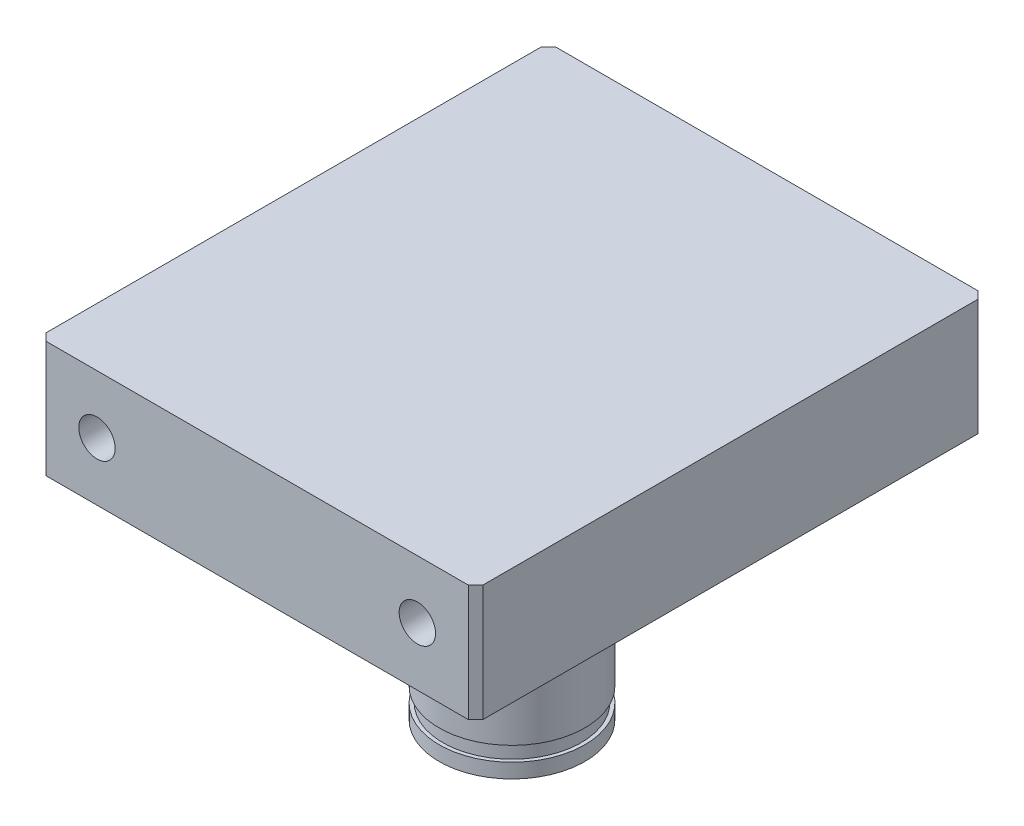
ISO-10303-21;
HEADER;
FILE_DESCRIPTION(('STEP AP214'),'2;1');
FILE_NAME('part.step','',(''),(''),'','','');
FILE_SCHEMA(('AUTOMOTIVE_DESIGN { 1 0 10303 214 1 1 1 1 }'));
ENDSEC;
DATA;
#1=APPLICATION_CONTEXT('core data for automotive mechanical design processes');
#2=APPLICATION_PROTOCOL_DEFINITION('international standard','automotive_design',2000,#1);
#3=PRODUCT_CONTEXT('',#1,'mechanical');
#4=PRODUCT('Part','Part','',(#3));
#5=PRODUCT_RELATED_PRODUCT_CATEGORY('part','',(#4));
#6=PRODUCT_DEFINITION_FORMATION('','',#4);
#7=PRODUCT_DEFINITION_CONTEXT('part definition',#1,'design');
#8=PRODUCT_DEFINITION('design','',#6,#7);
#9=PRODUCT_DEFINITION_SHAPE('','',#8);
#10=(LENGTH_UNIT() NAMED_UNIT(*) SI_UNIT(.MILLI.,.METRE.));
#11=(NAMED_UNIT(*) PLANE_ANGLE_UNIT() SI_UNIT($,.RADIAN.));
#12=(NAMED_UNIT(*) SI_UNIT($,.STERADIAN.) SOLID_ANGLE_UNIT());
#13=UNCERTAINTY_MEASURE_WITH_UNIT(LENGTH_MEASURE(1.E-05),#10,'distance_accuracy_value','');
#14=(GEOMETRIC_REPRESENTATION_CONTEXT(3) GLOBAL_UNCERTAINTY_ASSIGNED_CONTEXT((#13)) GLOBAL_UNIT_ASSIGNED_CONTEXT((#10,
#11,#12)) REPRESENTATION_CONTEXT('',''));
#15=CARTESIAN_POINT('',(0.,0.,0.));
#16=DIRECTION('',(0.,0.,1.));
#17=DIRECTION('',(1.,0.,0.));
#18=AXIS2_PLACEMENT_3D('',#15,#16,#17);
#19=CARTESIAN_POINT('',(0.,-15.,0.));
#20=DIRECTION('',(0.,1.,0.));
#21=DIRECTION('',(0.,0.,1.));
#22=AXIS2_PLACEMENT_3D('',#19,#20,#21);
#23=CYLINDRICAL_SURFACE('',#22,5.);
#24=CARTESIAN_POINT('',(0.,-5.,0.));
#25=DIRECTION('',(0.,-1.,0.));
#26=DIRECTION('',(0.,0.,-1.));
#27=AXIS2_PLACEMENT_3D('',#24,#25,#26);
#28=CIRCLE('',#27,5.);
#29=CARTESIAN_POINT('',(0.,-5.,-5.));
#30=VERTEX_POINT('',#29);
#31=EDGE_CURVE('E237',#30,#30,#28,.T.);
#32=ORIENTED_EDGE('',*,*,#31,.T.);
#33=EDGE_LOOP('',(#32));
#34=FACE_BOUND('',#33,.T.);
#35=CARTESIAN_POINT('',(0.,-13.,0.));
#36=DIRECTION('',(0.,-1.,0.));
#37=DIRECTION('',(0.,0.,-1.));
#38=AXIS2_PLACEMENT_3D('',#35,#36,#37);
#39=CIRCLE('',#38,5.);
#40=CARTESIAN_POINT('',(0.,-13.,-5.));
#41=VERTEX_POINT('',#40);
#42=EDGE_CURVE('E231',#41,#41,#39,.T.);
#43=ORIENTED_EDGE('',*,*,#42,.F.);
#44=EDGE_LOOP('',(#43));
#45=FACE_BOUND('',#44,.T.);
#46=ADVANCED_FACE('F38',(#34,#45),#23,.T.);
#47=CARTESIAN_POINT('',(0.,-3.,0.));
#48=DIRECTION('',(0.,-1.,0.));
#49=DIRECTION('',(0.,0.,-1.));
#50=AXIS2_PLACEMENT_3D('',#47,#48,#49);
#51=PLANE('',#50);
#52=CARTESIAN_POINT('',(0.,-3.,0.));
#53=DIRECTION('',(0.,-1.,0.));
#54=DIRECTION('',(0.,0.,-1.));
#55=AXIS2_PLACEMENT_3D('',#52,#53,#54);
#56=CIRCLE('',#55,8.5);
#57=CARTESIAN_POINT('',(0.,-3.,-8.5));
#58=VERTEX_POINT('',#57);
#59=EDGE_CURVE('E175',#58,#58,#56,.T.);
#60=ORIENTED_EDGE('',*,*,#59,.T.);
#61=EDGE_LOOP('',(#60));
#62=FACE_BOUND('',#61,.T.);
#63=CARTESIAN_POINT('',(0.,-3.,0.));
#64=DIRECTION('',(0.,-1.,0.));
#65=DIRECTION('',(0.,0.,-1.));
#66=AXIS2_PLACEMENT_3D('',#63,#64,#65);
#67=CIRCLE('',#66,7.5);
#68=CARTESIAN_POINT('',(0.,-3.,-7.5));
#69=VERTEX_POINT('',#68);
#70=EDGE_CURVE('E242',#69,#69,#67,.T.);
#71=ORIENTED_EDGE('',*,*,#70,.F.);
#72=EDGE_LOOP('',(#71));
#73=FACE_BOUND('',#72,.T.);
#74=ADVANCED_FACE('F256',(#62,#73),#51,.T.);
#75=CARTESIAN_POINT('',(0.,1.,0.));
#76=DIRECTION('',(0.,-1.,0.));
#77=DIRECTION('',(0.,0.,-1.));
#78=AXIS2_PLACEMENT_3D('',#75,#76,#77);
#79=PLANE('',#78);
#80=DIRECTION('',(1.,0.,0.));
#81=VECTOR('',#80,1.);
#82=CARTESIAN_POINT('',(-15.,0.999999999999999,-17.5));
#83=LINE('',#82,#81);
#84=CARTESIAN_POINT('',(-14.5,0.999999999999999,-17.5));
#85=VERTEX_POINT('',#84);
#86=CARTESIAN_POINT('',(14.5,0.999999999999999,-17.5));
#87=VERTEX_POINT('',#86);
#88=EDGE_CURVE('E184',#85,#87,#83,.T.);
#89=ORIENTED_EDGE('',*,*,#88,.T.);
#90=DIRECTION('',(0.707106781186543,0.,0.707106781186552));
#91=VECTOR('',#90,1.);
#92=CARTESIAN_POINT('',(14.5,0.999999999999999,-17.5));
#93=LINE('',#92,#91);
#94=CARTESIAN_POINT('',(15.,0.999999999999999,-17.));
#95=VERTEX_POINT('',#94);
#96=EDGE_CURVE('E138',#95,#87,#93,.F.);
#97=ORIENTED_EDGE('',*,*,#96,.F.);
#98=DIRECTION('',(0.,0.,1.));
#99=VECTOR('',#98,1.);
#100=CARTESIAN_POINT('',(15.,0.999999999999999,-17.5));
#101=LINE('',#100,#99);
#102=CARTESIAN_POINT('',(15.,0.999999999999999,17.));
#103=VERTEX_POINT('',#102);
#104=EDGE_CURVE('E166',#95,#103,#101,.T.);
#105=ORIENTED_EDGE('',*,*,#104,.T.);
#106=DIRECTION('',(-0.707106781186557,0.,0.707106781186538));
#107=VECTOR('',#106,1.);
#108=CARTESIAN_POINT('',(15.,0.999999999999999,17.));
#109=LINE('',#108,#107);
#110=CARTESIAN_POINT('',(14.5,0.999999999999999,17.5));
#111=VERTEX_POINT('',#110);
#112=EDGE_CURVE('E46',#111,#103,#109,.F.);
#113=ORIENTED_EDGE('',*,*,#112,.F.);
#114=DIRECTION('',(-1.,0.,0.));
#115=VECTOR('',#114,1.);
#116=CARTESIAN_POINT('',(-15.,0.999999999999999,17.5));
#117=LINE('',#116,#115);
#118=CARTESIAN_POINT('',(-14.5,0.999999999999999,17.5));
#119=VERTEX_POINT('',#118);
#120=EDGE_CURVE('E164',#111,#119,#117,.T.);
#121=ORIENTED_EDGE('',*,*,#120,.T.);
#122=DIRECTION('',(-0.707106781186543,0.,-0.707106781186552));
#123=VECTOR('',#122,1.);
#124=CARTESIAN_POINT('',(-14.5,0.999999999999999,17.5));
#125=LINE('',#124,#123);
#126=CARTESIAN_POINT('',(-15.,0.999999999999999,17.));
#127=VERTEX_POINT('',#126);
#128=EDGE_CURVE('E172',#127,#119,#125,.F.);
#129=ORIENTED_EDGE('',*,*,#128,.F.);
#130=DIRECTION('',(0.,0.,-1.));
#131=VECTOR('',#130,1.);
#132=CARTESIAN_POINT('',(-15.,0.999999999999999,-17.5));
#133=LINE('',#132,#131);
#134=CARTESIAN_POINT('',(-15.,0.999999999999999,-17.));
#135=VERTEX_POINT('',#134);
#136=EDGE_CURVE('E181',#127,#135,#133,.T.);
#137=ORIENTED_EDGE('',*,*,#136,.T.);
#138=DIRECTION('',(0.707106781186557,0.,-0.707106781186538));
#139=VECTOR('',#138,1.);
#140=CARTESIAN_POINT('',(-15.,0.999999999999999,-17.));
#141=LINE('',#140,#139);
#142=EDGE_CURVE('E142',#85,#135,#141,.F.);
#143=ORIENTED_EDGE('',*,*,#142,.F.);
#144=EDGE_LOOP('',(#89,#97,#105,#113,#121,#129,#137,#143));
#145=FACE_BOUND('',#144,.T.);
#146=CARTESIAN_POINT('',(0.,1.,0.));
#147=DIRECTION('',(0.,-1.,0.));
#148=DIRECTION('',(0.,0.,-1.));
#149=AXIS2_PLACEMENT_3D('',#146,#147,#148);
#150=CIRCLE('',#149,8.5);
#151=CARTESIAN_POINT('',(0.,1.,-8.5));
#152=VERTEX_POINT('',#151);
#153=EDGE_CURVE('E246',#152,#152,#150,.T.);
#154=ORIENTED_EDGE('',*,*,#153,.F.);
#155=EDGE_LOOP('',(#154));
#156=FACE_BOUND('',#155,.T.);
#157=ADVANCED_FACE('F162',(#145,#156),#79,.T.);
#158=CARTESIAN_POINT('',(15.,10.,-17.5));
#159=DIRECTION('',(-1.,0.,0.));
#160=DIRECTION('',(0.,0.,1.));
#161=AXIS2_PLACEMENT_3D('',#158,#159,#160);
#162=PLANE('',#161);
#163=DIRECTION('',(0.,1.,0.));
#164=VECTOR('',#163,1.);
#165=CARTESIAN_POINT('',(15.,10.,-17.));
#166=LINE('',#165,#164);
#167=CARTESIAN_POINT('',(15.,9.,-17.));
#168=VERTEX_POINT('',#167);
#169=EDGE_CURVE('E140',#95,#168,#166,.T.);
#170=ORIENTED_EDGE('',*,*,#169,.T.);
#171=DIRECTION('',(0.,0.,-1.));
#172=VECTOR('',#171,1.);
#173=CARTESIAN_POINT('',(15.,9.,17.5));
#174=LINE('',#173,#172);
#175=CARTESIAN_POINT('',(15.,9.,17.));
#176=VERTEX_POINT('',#175);
#177=EDGE_CURVE('E119',#176,#168,#174,.T.);
#178=ORIENTED_EDGE('',*,*,#177,.F.);
#179=DIRECTION('',(0.,-1.,0.));
#180=VECTOR('',#179,1.);
#181=CARTESIAN_POINT('',(15.,10.,17.));
#182=LINE('',#181,#180);
#183=EDGE_CURVE('E60',#176,#103,#182,.T.);
#184=ORIENTED_EDGE('',*,*,#183,.T.);
#185=ORIENTED_EDGE('',*,*,#104,.F.);
#186=EDGE_LOOP('',(#170,#178,#184,#185));
#187=FACE_BOUND('',#186,.T.);
#188=ADVANCED_FACE('F255',(#187),#162,.F.);
#189=CARTESIAN_POINT('',(-15.,10.,-17.5));
#190=DIRECTION('',(0.,0.,1.));
#191=DIRECTION('',(1.,0.,0.));
#192=AXIS2_PLACEMENT_3D('',#189,#190,#191);
#193=PLANE('',#192);
#194=CARTESIAN_POINT('',(11.,4.99999999999999,-17.5));
#195=DIRECTION('',(0.,0.,-1.));
#196=DIRECTION('',(-1.,0.,0.));
#197=AXIS2_PLACEMENT_3D('',#194,#195,#196);
#198=CIRCLE('',#197,1.24999999999999);
#199=CARTESIAN_POINT('',(9.75000000000001,4.99999999999999,-17.5));
#200=VERTEX_POINT('',#199);
#201=EDGE_CURVE('E124',#200,#200,#198,.T.);
#202=ORIENTED_EDGE('',*,*,#201,.F.);
#203=EDGE_LOOP('',(#202));
#204=FACE_BOUND('',#203,.T.);
#205=CARTESIAN_POINT('',(-11.,5.,-17.5));
#206=DIRECTION('',(0.,0.,-1.));
#207=DIRECTION('',(-1.,0.,0.));
#208=AXIS2_PLACEMENT_3D('',#205,#206,#207);
#209=CIRCLE('',#208,1.24999999999999);
#210=CARTESIAN_POINT('',(-12.25,5.,-17.5));
#211=VERTEX_POINT('',#210);
#212=EDGE_CURVE('E209',#211,#211,#209,.T.);
#213=ORIENTED_EDGE('',*,*,#212,.F.);
#214=EDGE_LOOP('',(#213));
#215=FACE_BOUND('',#214,.T.);
#216=DIRECTION('',(0.,1.,0.));
#217=VECTOR('',#216,1.);
#218=CARTESIAN_POINT('',(-14.5,10.,-17.5));
#219=LINE('',#218,#217);
#220=CARTESIAN_POINT('',(-14.5,9.,-17.5));
#221=VERTEX_POINT('',#220);
#222=EDGE_CURVE('E134',#85,#221,#219,.T.);
#223=ORIENTED_EDGE('',*,*,#222,.T.);
#224=DIRECTION('',(-1.,0.,0.));
#225=VECTOR('',#224,1.);
#226=CARTESIAN_POINT('',(15.,9.,-17.5));
#227=LINE('',#226,#225);
#228=CARTESIAN_POINT('',(14.5,9.,-17.5));
#229=VERTEX_POINT('',#228);
#230=EDGE_CURVE('E117',#229,#221,#227,.T.);
#231=ORIENTED_EDGE('',*,*,#230,.F.);
#232=DIRECTION('',(0.,-1.,0.));
#233=VECTOR('',#232,1.);
#234=CARTESIAN_POINT('',(14.5,10.,-17.5));
#235=LINE('',#234,#233);
#236=EDGE_CURVE('E131',#229,#87,#235,.T.);
#237=ORIENTED_EDGE('',*,*,#236,.T.);
#238=ORIENTED_EDGE('',*,*,#88,.F.);
#239=EDGE_LOOP('',(#223,#231,#237,#238));
#240=FACE_BOUND('',#239,.T.);
#241=ADVANCED_FACE('F129',(#204,#215,#240),#193,.F.);
#242=CARTESIAN_POINT('',(-15.,10.,-17.5));
#243=DIRECTION('',(1.,0.,0.));
#244=DIRECTION('',(0.,0.,-1.));
#245=AXIS2_PLACEMENT_3D('',#242,#243,#244);
#246=PLANE('',#245);
#247=DIRECTION('',(0.,1.,0.));
#248=VECTOR('',#247,1.);
#249=CARTESIAN_POINT('',(-15.,10.,17.));
#250=LINE('',#249,#248);
#251=CARTESIAN_POINT('',(-15.,9.,17.));
#252=VERTEX_POINT('',#251);
#253=EDGE_CURVE('E147',#127,#252,#250,.T.);
#254=ORIENTED_EDGE('',*,*,#253,.T.);
#255=DIRECTION('',(0.,0.,-1.));
#256=VECTOR('',#255,1.);
#257=CARTESIAN_POINT('',(-15.,9.,17.5));
#258=LINE('',#257,#256);
#259=CARTESIAN_POINT('',(-15.,9.,-17.));
#260=VERTEX_POINT('',#259);
#261=EDGE_CURVE('E198',#252,#260,#258,.T.);
#262=ORIENTED_EDGE('',*,*,#261,.T.);
#263=DIRECTION('',(0.,-1.,0.));
#264=VECTOR('',#263,1.);
#265=CARTESIAN_POINT('',(-15.,10.,-17.));
#266=LINE('',#265,#264);
#267=EDGE_CURVE('E150',#260,#135,#266,.T.);
#268=ORIENTED_EDGE('',*,*,#267,.T.);
#269=ORIENTED_EDGE('',*,*,#136,.F.);
#270=EDGE_LOOP('',(#254,#262,#268,#269));
#271=FACE_BOUND('',#270,.T.);
#272=ADVANCED_FACE('F192',(#271),#246,.F.);
#273=CARTESIAN_POINT('',(-15.,10.,17.5));
#274=DIRECTION('',(0.,0.,-1.));
#275=DIRECTION('',(-1.,0.,0.));
#276=AXIS2_PLACEMENT_3D('',#273,#274,#275);
#277=PLANE('',#276);
#278=CARTESIAN_POINT('',(11.,4.99999999999999,17.5));
#279=DIRECTION('',(0.,0.,1.));
#280=DIRECTION('',(1.,0.,0.));
#281=AXIS2_PLACEMENT_3D('',#278,#279,#280);
#282=CIRCLE('',#281,1.24999999999999);
#283=CARTESIAN_POINT('',(12.25,4.99999999999999,17.5));
#284=VERTEX_POINT('',#283);
#285=EDGE_CURVE('E215',#284,#284,#282,.T.);
#286=ORIENTED_EDGE('',*,*,#285,.F.);
#287=EDGE_LOOP('',(#286));
#288=FACE_BOUND('',#287,.T.);
#289=CARTESIAN_POINT('',(-11.,5.,17.5));
#290=DIRECTION('',(0.,0.,1.));
#291=DIRECTION('',(1.,0.,0.));
#292=AXIS2_PLACEMENT_3D('',#289,#290,#291);
#293=CIRCLE('',#292,1.24999999999999);
#294=CARTESIAN_POINT('',(-9.75,5.,17.5));
#295=VERTEX_POINT('',#294);
#296=EDGE_CURVE('E221',#295,#295,#293,.T.);
#297=ORIENTED_EDGE('',*,*,#296,.F.);
#298=EDGE_LOOP('',(#297));
#299=FACE_BOUND('',#298,.T.);
#300=DIRECTION('',(0.,1.,0.));
#301=VECTOR('',#300,1.);
#302=CARTESIAN_POINT('',(14.5,10.,17.5));
#303=LINE('',#302,#301);
#304=CARTESIAN_POINT('',(14.5,9.,17.5));
#305=VERTEX_POINT('',#304);
#306=EDGE_CURVE('E152',#111,#305,#303,.T.);
#307=ORIENTED_EDGE('',*,*,#306,.T.);
#308=DIRECTION('',(-1.,0.,0.));
#309=VECTOR('',#308,1.);
#310=CARTESIAN_POINT('',(15.,9.,17.5));
#311=LINE('',#310,#309);
#312=CARTESIAN_POINT('',(-14.5,9.,17.5));
#313=VERTEX_POINT('',#312);
#314=EDGE_CURVE('E52',#305,#313,#311,.T.);
#315=ORIENTED_EDGE('',*,*,#314,.T.);
#316=DIRECTION('',(0.,-1.,0.));
#317=VECTOR('',#316,1.);
#318=CARTESIAN_POINT('',(-14.5,10.,17.5));
#319=LINE('',#318,#317);
#320=EDGE_CURVE('E155',#313,#119,#319,.T.);
#321=ORIENTED_EDGE('',*,*,#320,.T.);
#322=ORIENTED_EDGE('',*,*,#120,.F.);
#323=EDGE_LOOP('',(#307,#315,#321,#322));
#324=FACE_BOUND('',#323,.T.);
#325=ADVANCED_FACE('F168',(#288,#299,#324),#277,.F.);
#326=CARTESIAN_POINT('',(14.5,10.,-17.5));
#327=DIRECTION('',(-0.707106781186552,0.,0.707106781186543));
#328=DIRECTION('',(0.,-1.,0.));
#329=AXIS2_PLACEMENT_3D('',#326,#327,#328);
#330=PLANE('',#329);
#331=DIRECTION('',(0.707106781186543,0.,0.707106781186552));
#332=VECTOR('',#331,1.);
#333=CARTESIAN_POINT('',(14.5,9.,-17.5));
#334=LINE('',#333,#332);
#335=EDGE_CURVE('E114',#168,#229,#334,.F.);
#336=ORIENTED_EDGE('',*,*,#335,.F.);
#337=ORIENTED_EDGE('',*,*,#169,.F.);
#338=ORIENTED_EDGE('',*,*,#96,.T.);
#339=ORIENTED_EDGE('',*,*,#236,.F.);
#340=EDGE_LOOP('',(#336,#337,#338,#339));
#341=FACE_BOUND('',#340,.T.);
#342=ADVANCED_FACE('F137',(#341),#330,.F.);
#343=CARTESIAN_POINT('',(-15.,10.,-17.));
#344=DIRECTION('',(0.707106781186538,0.,0.707106781186557));
#345=DIRECTION('',(0.,-1.,0.));
#346=AXIS2_PLACEMENT_3D('',#343,#344,#345);
#347=PLANE('',#346);
#348=DIRECTION('',(0.707106781186557,0.,-0.707106781186538));
#349=VECTOR('',#348,1.);
#350=CARTESIAN_POINT('',(-15.,9.,-17.));
#351=LINE('',#350,#349);
#352=EDGE_CURVE('E125',#221,#260,#351,.F.);
#353=ORIENTED_EDGE('',*,*,#352,.F.);
#354=ORIENTED_EDGE('',*,*,#222,.F.);
#355=ORIENTED_EDGE('',*,*,#142,.T.);
#356=ORIENTED_EDGE('',*,*,#267,.F.);
#357=EDGE_LOOP('',(#353,#354,#355,#356));
#358=FACE_BOUND('',#357,.T.);
#359=ADVANCED_FACE('F188',(#358),#347,.F.);
#360=CARTESIAN_POINT('',(-14.5,10.,17.5));
#361=DIRECTION('',(0.707106781186552,0.,-0.707106781186543));
#362=DIRECTION('',(0.,-1.,0.));
#363=AXIS2_PLACEMENT_3D('',#360,#361,#362);
#364=PLANE('',#363);
#365=DIRECTION('',(-0.707106781186543,0.,-0.707106781186552));
#366=VECTOR('',#365,1.);
#367=CARTESIAN_POINT('',(-14.5,9.,17.5));
#368=LINE('',#367,#366);
#369=EDGE_CURVE('E197',#252,#313,#368,.F.);
#370=ORIENTED_EDGE('',*,*,#369,.F.);
#371=ORIENTED_EDGE('',*,*,#253,.F.);
#372=ORIENTED_EDGE('',*,*,#128,.T.);
#373=ORIENTED_EDGE('',*,*,#320,.F.);
#374=EDGE_LOOP('',(#370,#371,#372,#373));
#375=FACE_BOUND('',#374,.T.);
#376=ADVANCED_FACE('F196',(#375),#364,.F.);
#377=CARTESIAN_POINT('',(15.,10.,17.));
#378=DIRECTION('',(-0.707106781186538,0.,-0.707106781186557));
#379=DIRECTION('',(0.,-1.,0.));
#380=AXIS2_PLACEMENT_3D('',#377,#378,#379);
#381=PLANE('',#380);
#382=DIRECTION('',(-0.707106781186557,0.,0.707106781186538));
#383=VECTOR('',#382,1.);
#384=CARTESIAN_POINT('',(15.,9.,17.));
#385=LINE('',#384,#383);
#386=EDGE_CURVE('E11',#305,#176,#385,.F.);
#387=ORIENTED_EDGE('',*,*,#386,.F.);
#388=ORIENTED_EDGE('',*,*,#306,.F.);
#389=ORIENTED_EDGE('',*,*,#112,.T.);
#390=ORIENTED_EDGE('',*,*,#183,.F.);
#391=EDGE_LOOP('',(#387,#388,#389,#390));
#392=FACE_BOUND('',#391,.T.);
#393=ADVANCED_FACE('F40',(#392),#381,.F.);
#394=CARTESIAN_POINT('',(0.,-3.,0.));
#395=DIRECTION('',(0.,1.,0.));
#396=DIRECTION('',(0.,0.,1.));
#397=AXIS2_PLACEMENT_3D('',#394,#395,#396);
#398=CYLINDRICAL_SURFACE('',#397,8.5);
#399=ORIENTED_EDGE('',*,*,#59,.F.);
#400=EDGE_LOOP('',(#399));
#401=FACE_BOUND('',#400,.T.);
#402=ORIENTED_EDGE('',*,*,#153,.T.);
#403=EDGE_LOOP('',(#402));
#404=FACE_BOUND('',#403,.T.);
#405=ADVANCED_FACE('F253',(#401,#404),#398,.T.);
#406=CARTESIAN_POINT('',(0.,-5.,0.));
#407=DIRECTION('',(0.,-1.,0.));
#408=DIRECTION('',(0.,0.,-1.));
#409=AXIS2_PLACEMENT_3D('',#406,#407,#408);
#410=PLANE('',#409);
#411=CARTESIAN_POINT('',(0.,-5.,0.));
#412=DIRECTION('',(0.,-1.,0.));
#413=DIRECTION('',(0.,0.,-1.));
#414=AXIS2_PLACEMENT_3D('',#411,#412,#413);
#415=CIRCLE('',#414,7.5);
#416=CARTESIAN_POINT('',(0.,-5.,-7.5));
#417=VERTEX_POINT('',#416);
#418=EDGE_CURVE('E243',#417,#417,#415,.T.);
#419=ORIENTED_EDGE('',*,*,#418,.T.);
#420=EDGE_LOOP('',(#419));
#421=FACE_BOUND('',#420,.T.);
#422=ORIENTED_EDGE('',*,*,#31,.F.);
#423=EDGE_LOOP('',(#422));
#424=FACE_BOUND('',#423,.T.);
#425=ADVANCED_FACE('F310',(#421,#424),#410,.T.);
#426=CARTESIAN_POINT('',(0.,-5.,0.));
#427=DIRECTION('',(0.,1.,0.));
#428=DIRECTION('',(0.,0.,1.));
#429=AXIS2_PLACEMENT_3D('',#426,#427,#428);
#430=CYLINDRICAL_SURFACE('',#429,7.5);
#431=ORIENTED_EDGE('',*,*,#418,.F.);
#432=EDGE_LOOP('',(#431));
#433=FACE_BOUND('',#432,.T.);
#434=ORIENTED_EDGE('',*,*,#70,.T.);
#435=EDGE_LOOP('',(#434));
#436=FACE_BOUND('',#435,.T.);
#437=ADVANCED_FACE('F295',(#433,#436),#430,.T.);
#438=CARTESIAN_POINT('',(0.,-14.,0.));
#439=DIRECTION('',(0.,-1.,0.));
#440=DIRECTION('',(0.,0.,-1.));
#441=AXIS2_PLACEMENT_3D('',#438,#439,#440);
#442=PLANE('',#441);
#443=CARTESIAN_POINT('',(0.,-14.,0.));
#444=DIRECTION('',(0.,-1.,0.));
#445=DIRECTION('',(0.,0.,-1.));
#446=AXIS2_PLACEMENT_3D('',#443,#444,#445);
#447=CIRCLE('',#446,5.);
#448=CARTESIAN_POINT('',(0.,-14.,-5.));
#449=VERTEX_POINT('',#448);
#450=EDGE_CURVE('E234',#449,#449,#447,.T.);
#451=ORIENTED_EDGE('',*,*,#450,.F.);
#452=EDGE_LOOP('',(#451));
#453=FACE_BOUND('',#452,.T.);
#454=CARTESIAN_POINT('',(0.,-14.,0.));
#455=DIRECTION('',(0.,-1.,0.));
#456=DIRECTION('',(0.,0.,-1.));
#457=AXIS2_PLACEMENT_3D('',#454,#455,#456);
#458=CIRCLE('',#457,4.75);
#459=CARTESIAN_POINT('',(0.,-14.,-4.75));
#460=VERTEX_POINT('',#459);
#461=EDGE_CURVE('E228',#460,#460,#458,.T.);
#462=ORIENTED_EDGE('',*,*,#461,.T.);
#463=EDGE_LOOP('',(#462));
#464=FACE_BOUND('',#463,.T.);
#465=ADVANCED_FACE('F291',(#453,#464),#442,.F.);
#466=CARTESIAN_POINT('',(0.,-13.,0.));
#467=DIRECTION('',(0.,-1.,0.));
#468=DIRECTION('',(0.,0.,-1.));
#469=AXIS2_PLACEMENT_3D('',#466,#467,#468);
#470=PLANE('',#469);
#471=ORIENTED_EDGE('',*,*,#42,.T.);
#472=EDGE_LOOP('',(#471));
#473=FACE_BOUND('',#472,.T.);
#474=CARTESIAN_POINT('',(0.,-13.,0.));
#475=DIRECTION('',(0.,-1.,0.));
#476=DIRECTION('',(0.,0.,-1.));
#477=AXIS2_PLACEMENT_3D('',#474,#475,#476);
#478=CIRCLE('',#477,4.75);
#479=CARTESIAN_POINT('',(0.,-13.,-4.75));
#480=VERTEX_POINT('',#479);
#481=EDGE_CURVE('E227',#480,#480,#478,.T.);
#482=ORIENTED_EDGE('',*,*,#481,.F.);
#483=EDGE_LOOP('',(#482));
#484=FACE_BOUND('',#483,.T.);
#485=ADVANCED_FACE('F294',(#473,#484),#470,.T.);
#486=CARTESIAN_POINT('',(0.,-14.,0.));
#487=DIRECTION('',(0.,1.,0.));
#488=DIRECTION('',(0.,0.,1.));
#489=AXIS2_PLACEMENT_3D('',#486,#487,#488);
#490=CYLINDRICAL_SURFACE('',#489,4.75);
#491=ORIENTED_EDGE('',*,*,#461,.F.);
#492=EDGE_LOOP('',(#491));
#493=FACE_BOUND('',#492,.T.);
#494=ORIENTED_EDGE('',*,*,#481,.T.);
#495=EDGE_LOOP('',(#494));
#496=FACE_BOUND('',#495,.T.);
#497=ADVANCED_FACE('F285',(#493,#496),#490,.T.);
#498=CARTESIAN_POINT('',(0.,-15.,0.));
#499=DIRECTION('',(0.,-1.,0.));
#500=DIRECTION('',(0.,0.,-1.));
#501=AXIS2_PLACEMENT_3D('',#498,#499,#500);
#502=PLANE('',#501);
#503=CARTESIAN_POINT('',(0.,-15.,0.));
#504=DIRECTION('',(0.,-1.,0.));
#505=DIRECTION('',(0.,0.,-1.));
#506=AXIS2_PLACEMENT_3D('',#503,#504,#505);
#507=CIRCLE('',#506,5.);
#508=CARTESIAN_POINT('',(0.,-15.,-5.));
#509=VERTEX_POINT('',#508);
#510=EDGE_CURVE('E170',#509,#509,#507,.T.);
#511=ORIENTED_EDGE('',*,*,#510,.T.);
#512=EDGE_LOOP('',(#511));
#513=FACE_BOUND('',#512,.T.);
#514=ADVANCED_FACE('F276',(#513),#502,.T.);
#515=ORIENTED_EDGE('',*,*,#450,.T.);
#516=EDGE_LOOP('',(#515));
#517=FACE_BOUND('',#516,.T.);
#518=ORIENTED_EDGE('',*,*,#510,.F.);
#519=EDGE_LOOP('',(#518));
#520=FACE_BOUND('',#519,.T.);
#521=ADVANCED_FACE('F269',(#517,#520),#23,.T.);
#522=CARTESIAN_POINT('',(-11.,5.,9.50000000000001));
#523=DIRECTION('',(0.,0.,1.));
#524=DIRECTION('',(1.,0.,0.));
#525=AXIS2_PLACEMENT_3D('',#522,#523,#524);
#526=CONICAL_SURFACE('',#525,1.24999999999999,1.02974425867664);
#527=CARTESIAN_POINT('',(-11.,5.,8.74892422621555));
#528=VERTEX_POINT('',#527);
#529=VERTEX_LOOP('',#528);
#530=FACE_BOUND('',#529,.T.);
#531=CARTESIAN_POINT('',(-11.,5.,9.50000000000001));
#532=DIRECTION('',(0.,0.,1.));
#533=DIRECTION('',(1.,0.,0.));
#534=AXIS2_PLACEMENT_3D('',#531,#532,#533);
#535=CIRCLE('',#534,1.24999999999999);
#536=CARTESIAN_POINT('',(-9.75000000000001,5.,9.50000000000001));
#537=VERTEX_POINT('',#536);
#538=EDGE_CURVE('E224',#537,#537,#535,.T.);
#539=ORIENTED_EDGE('',*,*,#538,.T.);
#540=EDGE_LOOP('',(#539));
#541=FACE_BOUND('',#540,.T.);
#542=ADVANCED_FACE('F275',(#530,#541),#526,.F.);
#543=CARTESIAN_POINT('',(-11.,5.,17.5));
#544=DIRECTION('',(0.,0.,1.));
#545=DIRECTION('',(1.,0.,0.));
#546=AXIS2_PLACEMENT_3D('',#543,#544,#545);
#547=CYLINDRICAL_SURFACE('',#546,1.24999999999999);
#548=ORIENTED_EDGE('',*,*,#538,.F.);
#549=EDGE_LOOP('',(#548));
#550=FACE_BOUND('',#549,.T.);
#551=ORIENTED_EDGE('',*,*,#296,.T.);
#552=EDGE_LOOP('',(#551));
#553=FACE_BOUND('',#552,.T.);
#554=ADVANCED_FACE('F282',(#550,#553),#547,.F.);
#555=CARTESIAN_POINT('',(11.,4.99999999999999,9.50000000000001));
#556=DIRECTION('',(0.,0.,1.));
#557=DIRECTION('',(1.,0.,0.));
#558=AXIS2_PLACEMENT_3D('',#555,#556,#557);
#559=CONICAL_SURFACE('',#558,1.24999999999999,1.02974425867664);
#560=CARTESIAN_POINT('',(11.,4.99999999999999,8.74892422621555));
#561=VERTEX_POINT('',#560);
#562=VERTEX_LOOP('',#561);
#563=FACE_BOUND('',#562,.T.);
#564=CARTESIAN_POINT('',(11.,4.99999999999999,9.50000000000001));
#565=DIRECTION('',(0.,0.,1.));
#566=DIRECTION('',(1.,0.,0.));
#567=AXIS2_PLACEMENT_3D('',#564,#565,#566);
#568=CIRCLE('',#567,1.24999999999999);
#569=CARTESIAN_POINT('',(12.25,4.99999999999999,9.50000000000001));
#570=VERTEX_POINT('',#569);
#571=EDGE_CURVE('E218',#570,#570,#568,.T.);
#572=ORIENTED_EDGE('',*,*,#571,.T.);
#573=EDGE_LOOP('',(#572));
#574=FACE_BOUND('',#573,.T.);
#575=ADVANCED_FACE('F349',(#563,#574),#559,.F.);
#576=CARTESIAN_POINT('',(11.,4.99999999999999,17.5));
#577=DIRECTION('',(0.,0.,1.));
#578=DIRECTION('',(1.,0.,0.));
#579=AXIS2_PLACEMENT_3D('',#576,#577,#578);
#580=CYLINDRICAL_SURFACE('',#579,1.24999999999999);
#581=ORIENTED_EDGE('',*,*,#571,.F.);
#582=EDGE_LOOP('',(#581));
#583=FACE_BOUND('',#582,.T.);
#584=ORIENTED_EDGE('',*,*,#285,.T.);
#585=EDGE_LOOP('',(#584));
#586=FACE_BOUND('',#585,.T.);
#587=ADVANCED_FACE('F355',(#583,#586),#580,.F.);
#588=CARTESIAN_POINT('',(-11.,5.,-9.50000000000001));
#589=DIRECTION('',(0.,0.,-1.));
#590=DIRECTION('',(-1.,0.,0.));
#591=AXIS2_PLACEMENT_3D('',#588,#589,#590);
#592=CONICAL_SURFACE('',#591,1.24999999999999,1.02974425867664);
#593=CARTESIAN_POINT('',(-11.,5.,-8.74892422621555));
#594=VERTEX_POINT('',#593);
#595=VERTEX_LOOP('',#594);
#596=FACE_BOUND('',#595,.T.);
#597=CARTESIAN_POINT('',(-11.,5.,-9.50000000000001));
#598=DIRECTION('',(0.,0.,-1.));
#599=DIRECTION('',(-1.,0.,0.));
#600=AXIS2_PLACEMENT_3D('',#597,#598,#599);
#601=CIRCLE('',#600,1.24999999999999);
#602=CARTESIAN_POINT('',(-12.25,5.,-9.50000000000001));
#603=VERTEX_POINT('',#602);
#604=EDGE_CURVE('E212',#603,#603,#601,.T.);
#605=ORIENTED_EDGE('',*,*,#604,.T.);
#606=EDGE_LOOP('',(#605));
#607=FACE_BOUND('',#606,.T.);
#608=ADVANCED_FACE('F362',(#596,#607),#592,.F.);
#609=CARTESIAN_POINT('',(-11.,5.,-17.5));
#610=DIRECTION('',(0.,0.,-1.));
#611=DIRECTION('',(-1.,0.,0.));
#612=AXIS2_PLACEMENT_3D('',#609,#610,#611);
#613=CYLINDRICAL_SURFACE('',#612,1.24999999999999);
#614=ORIENTED_EDGE('',*,*,#604,.F.);
#615=EDGE_LOOP('',(#614));
#616=FACE_BOUND('',#615,.T.);
#617=ORIENTED_EDGE('',*,*,#212,.T.);
#618=EDGE_LOOP('',(#617));
#619=FACE_BOUND('',#618,.T.);
#620=ADVANCED_FACE('F366',(#616,#619),#613,.F.);
#621=CARTESIAN_POINT('',(11.,4.99999999999999,-9.50000000000001));
#622=DIRECTION('',(0.,0.,-1.));
#623=DIRECTION('',(-1.,0.,0.));
#624=AXIS2_PLACEMENT_3D('',#621,#622,#623);
#625=CONICAL_SURFACE('',#624,1.24999999999999,1.02974425867664);
#626=CARTESIAN_POINT('',(11.,4.99999999999999,-8.74892422621555));
#627=VERTEX_POINT('',#626);
#628=VERTEX_LOOP('',#627);
#629=FACE_BOUND('',#628,.T.);
#630=CARTESIAN_POINT('',(11.,4.99999999999999,-9.50000000000001));
#631=DIRECTION('',(0.,0.,-1.));
#632=DIRECTION('',(-1.,0.,0.));
#633=AXIS2_PLACEMENT_3D('',#630,#631,#632);
#634=CIRCLE('',#633,1.24999999999999);
#635=CARTESIAN_POINT('',(9.75000000000001,4.99999999999999,-9.50000000000001));
#636=VERTEX_POINT('',#635);
#637=EDGE_CURVE('E206',#636,#636,#634,.T.);
#638=ORIENTED_EDGE('',*,*,#637,.T.);
#639=EDGE_LOOP('',(#638));
#640=FACE_BOUND('',#639,.T.);
#641=ADVANCED_FACE('F370',(#629,#640),#625,.F.);
#642=CARTESIAN_POINT('',(11.,4.99999999999999,-17.5));
#643=DIRECTION('',(0.,0.,-1.));
#644=DIRECTION('',(-1.,0.,0.));
#645=AXIS2_PLACEMENT_3D('',#642,#643,#644);
#646=CYLINDRICAL_SURFACE('',#645,1.24999999999999);
#647=ORIENTED_EDGE('',*,*,#637,.F.);
#648=EDGE_LOOP('',(#647));
#649=FACE_BOUND('',#648,.T.);
#650=ORIENTED_EDGE('',*,*,#201,.T.);
#651=EDGE_LOOP('',(#650));
#652=FACE_BOUND('',#651,.T.);
#653=ADVANCED_FACE('F374',(#649,#652),#646,.F.);
#654=CARTESIAN_POINT('',(15.,9.,17.5));
#655=DIRECTION('',(0.,-1.,0.));
#656=DIRECTION('',(0.,0.,-1.));
#657=AXIS2_PLACEMENT_3D('',#654,#655,#656);
#658=PLANE('',#657);
#659=ORIENTED_EDGE('',*,*,#335,.T.);
#660=ORIENTED_EDGE('',*,*,#230,.T.);
#661=ORIENTED_EDGE('',*,*,#352,.T.);
#662=ORIENTED_EDGE('',*,*,#261,.F.);
#663=ORIENTED_EDGE('',*,*,#369,.T.);
#664=ORIENTED_EDGE('',*,*,#314,.F.);
#665=ORIENTED_EDGE('',*,*,#386,.T.);
#666=ORIENTED_EDGE('',*,*,#177,.T.);
#667=EDGE_LOOP('',(#659,#660,#661,#662,#663,#664,#665,#666));
#668=FACE_BOUND('',#667,.T.);
#669=ADVANCED_FACE('F116',(#668),#658,.F.);
#670=CLOSED_SHELL('',(#46,#74,#157,#188,#241,#272,#325,#342,#359,#376,#393,#405,#425,#437,#465,
#485,#497,#514,#521,#542,#554,#575,#587,#608,#620,#641,#653,#669));
#671=MANIFOLD_SOLID_BREP('B2',#670);
#672=ADVANCED_BREP_SHAPE_REPRESENTATION('',(#18,#671),#14);
#673=SHAPE_DEFINITION_REPRESENTATION(#9,#672);
ENDSEC;
END-ISO-10303-21;
